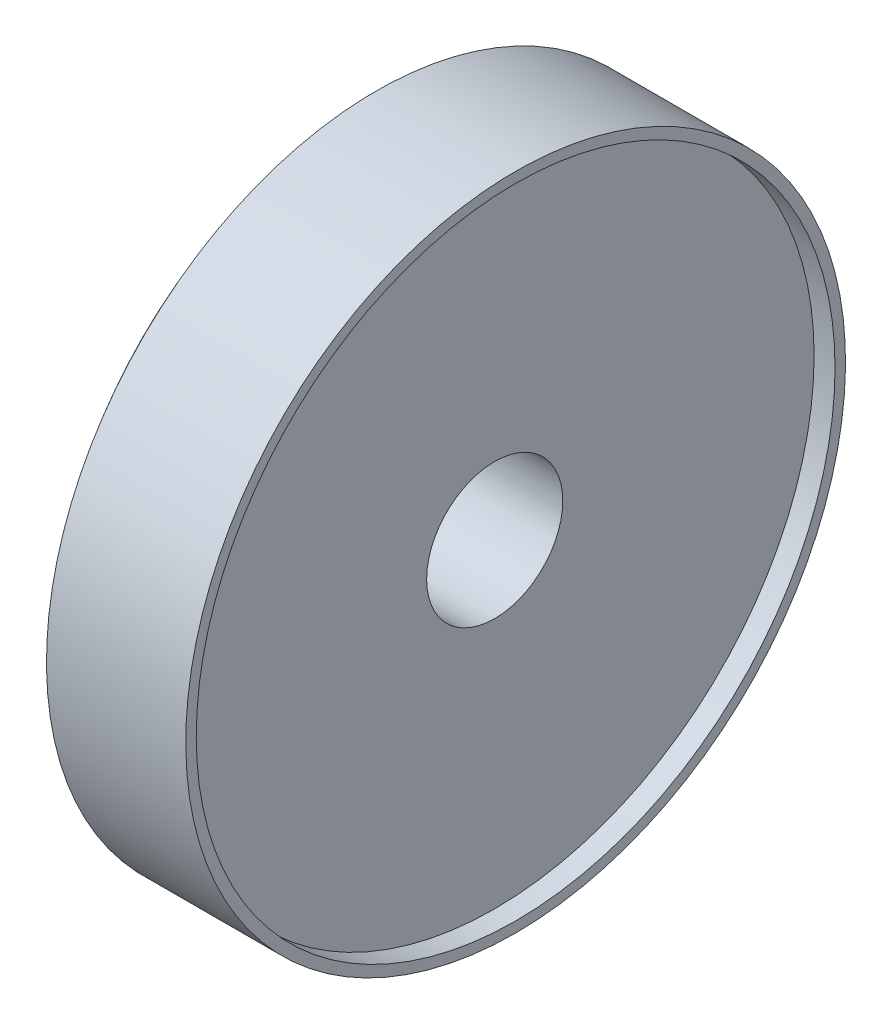
ISO-10303-21;
HEADER;
FILE_DESCRIPTION(('STEP AP214'),'2;1');
FILE_NAME('part.step','',(''),(''),'','','');
FILE_SCHEMA(('AUTOMOTIVE_DESIGN { 1 0 10303 214 1 1 1 1 }'));
ENDSEC;
DATA;
#1=APPLICATION_CONTEXT('core data for automotive mechanical design processes');
#2=APPLICATION_PROTOCOL_DEFINITION('international standard','automotive_design',2000,#1);
#3=PRODUCT_CONTEXT('',#1,'mechanical');
#4=PRODUCT('Part','Part','',(#3));
#5=PRODUCT_RELATED_PRODUCT_CATEGORY('part','',(#4));
#6=PRODUCT_DEFINITION_FORMATION('','',#4);
#7=PRODUCT_DEFINITION_CONTEXT('part definition',#1,'design');
#8=PRODUCT_DEFINITION('design','',#6,#7);
#9=PRODUCT_DEFINITION_SHAPE('','',#8);
#10=(LENGTH_UNIT() NAMED_UNIT(*) SI_UNIT(.MILLI.,.METRE.));
#11=(NAMED_UNIT(*) PLANE_ANGLE_UNIT() SI_UNIT($,.RADIAN.));
#12=(NAMED_UNIT(*) SI_UNIT($,.STERADIAN.) SOLID_ANGLE_UNIT());
#13=UNCERTAINTY_MEASURE_WITH_UNIT(LENGTH_MEASURE(1.E-05),#10,'distance_accuracy_value','');
#14=(GEOMETRIC_REPRESENTATION_CONTEXT(3) GLOBAL_UNCERTAINTY_ASSIGNED_CONTEXT((#13)) GLOBAL_UNIT_ASSIGNED_CONTEXT((#10,
#11,#12)) REPRESENTATION_CONTEXT('',''));
#15=CARTESIAN_POINT('',(0.,0.,0.));
#16=DIRECTION('',(0.,0.,1.));
#17=DIRECTION('',(1.,0.,0.));
#18=AXIS2_PLACEMENT_3D('',#15,#16,#17);
#19=CARTESIAN_POINT('',(-7.9,0.,0.));
#20=DIRECTION('',(-1.,0.,0.));
#21=DIRECTION('',(0.,-1.,0.));
#22=AXIS2_PLACEMENT_3D('',#19,#20,#21);
#23=CYLINDRICAL_SURFACE('',#22,31.5);
#24=CARTESIAN_POINT('',(-5.39999999999999,0.,0.));
#25=DIRECTION('',(-1.,0.,0.));
#26=DIRECTION('',(0.,-1.,0.));
#27=AXIS2_PLACEMENT_3D('',#24,#25,#26);
#28=CIRCLE('',#27,31.5);
#29=CARTESIAN_POINT('',(-5.39999999999998,-31.5,0.));
#30=VERTEX_POINT('',#29);
#31=EDGE_CURVE('E189',#30,#30,#28,.T.);
#32=ORIENTED_EDGE('',*,*,#31,.F.);
#33=EDGE_LOOP('',(#32));
#34=FACE_BOUND('',#33,.T.);
#35=CARTESIAN_POINT('',(7.9,0.,0.));
#36=DIRECTION('',(-1.,0.,0.));
#37=DIRECTION('',(0.,-1.,0.));
#38=AXIS2_PLACEMENT_3D('',#35,#36,#37);
#39=CIRCLE('',#38,31.5);
#40=CARTESIAN_POINT('',(7.90000000000001,-31.5,0.));
#41=VERTEX_POINT('',#40);
#42=EDGE_CURVE('E11',#41,#41,#39,.T.);
#43=ORIENTED_EDGE('',*,*,#42,.T.);
#44=EDGE_LOOP('',(#43));
#45=FACE_BOUND('',#44,.T.);
#46=ADVANCED_FACE('F37',(#34,#45),#23,.T.);
#47=CARTESIAN_POINT('',(7.9,0.,0.));
#48=DIRECTION('',(-1.,0.,0.));
#49=DIRECTION('',(0.,-1.,0.));
#50=AXIS2_PLACEMENT_3D('',#47,#48,#49);
#51=PLANE('',#50);
#52=CARTESIAN_POINT('',(7.9,0.,0.));
#53=DIRECTION('',(1.,0.,0.));
#54=DIRECTION('',(0.,1.,0.));
#55=AXIS2_PLACEMENT_3D('',#52,#53,#54);
#56=CIRCLE('',#55,30.5);
#57=CARTESIAN_POINT('',(7.9,30.5,0.));
#58=VERTEX_POINT('',#57);
#59=EDGE_CURVE('E185',#58,#58,#56,.T.);
#60=ORIENTED_EDGE('',*,*,#59,.F.);
#61=EDGE_LOOP('',(#60));
#62=FACE_BOUND('',#61,.T.);
#63=ORIENTED_EDGE('',*,*,#42,.F.);
#64=EDGE_LOOP('',(#63));
#65=FACE_BOUND('',#64,.T.);
#66=ADVANCED_FACE('F207',(#62,#65),#51,.F.);
#67=CARTESIAN_POINT('',(-7.9,0.,0.));
#68=DIRECTION('',(1.,0.,0.));
#69=DIRECTION('',(0.,1.,0.));
#70=AXIS2_PLACEMENT_3D('',#67,#68,#69);
#71=PLANE('',#70);
#72=CARTESIAN_POINT('',(-7.9,0.,0.));
#73=DIRECTION('',(-1.,0.,0.));
#74=DIRECTION('',(0.,-1.,0.));
#75=AXIS2_PLACEMENT_3D('',#72,#73,#74);
#76=CIRCLE('',#75,6.5);
#77=CARTESIAN_POINT('',(-7.89999999999999,-6.5,0.));
#78=VERTEX_POINT('',#77);
#79=EDGE_CURVE('E354',#78,#78,#76,.T.);
#80=ORIENTED_EDGE('',*,*,#79,.F.);
#81=EDGE_LOOP('',(#80));
#82=FACE_BOUND('',#81,.T.);
#83=CARTESIAN_POINT('',(-7.9,12.5,0.));
#84=DIRECTION('',(-1.,0.,0.));
#85=DIRECTION('',(0.,0.,1.));
#86=AXIS2_PLACEMENT_3D('',#83,#84,#85);
#87=CIRCLE('',#86,1.525);
#88=CARTESIAN_POINT('',(-7.9,12.5,1.525));
#89=VERTEX_POINT('',#88);
#90=EDGE_CURVE('E98',#89,#89,#87,.T.);
#91=ORIENTED_EDGE('',*,*,#90,.F.);
#92=EDGE_LOOP('',(#91));
#93=FACE_BOUND('',#92,.T.);
#94=CARTESIAN_POINT('',(-7.9,0.,-12.5));
#95=DIRECTION('',(-1.,0.,0.));
#96=DIRECTION('',(0.,0.,1.));
#97=AXIS2_PLACEMENT_3D('',#94,#95,#96);
#98=CIRCLE('',#97,1.525);
#99=CARTESIAN_POINT('',(-7.9,0.,-10.975));
#100=VERTEX_POINT('',#99);
#101=EDGE_CURVE('E91',#100,#100,#98,.T.);
#102=ORIENTED_EDGE('',*,*,#101,.F.);
#103=EDGE_LOOP('',(#102));
#104=FACE_BOUND('',#103,.T.);
#105=CARTESIAN_POINT('',(-7.9,-12.5,0.));
#106=DIRECTION('',(-1.,0.,0.));
#107=DIRECTION('',(0.,0.,1.));
#108=AXIS2_PLACEMENT_3D('',#105,#106,#107);
#109=CIRCLE('',#108,1.525);
#110=CARTESIAN_POINT('',(-7.9,-12.5,1.525));
#111=VERTEX_POINT('',#110);
#112=EDGE_CURVE('E107',#111,#111,#109,.T.);
#113=ORIENTED_EDGE('',*,*,#112,.F.);
#114=EDGE_LOOP('',(#113));
#115=FACE_BOUND('',#114,.T.);
#116=CARTESIAN_POINT('',(-7.9,0.,12.5));
#117=DIRECTION('',(-1.,0.,0.));
#118=DIRECTION('',(0.,0.,1.));
#119=AXIS2_PLACEMENT_3D('',#116,#117,#118);
#120=CIRCLE('',#119,1.525);
#121=CARTESIAN_POINT('',(-7.9,0.,14.025));
#122=VERTEX_POINT('',#121);
#123=EDGE_CURVE('E116',#122,#122,#120,.T.);
#124=ORIENTED_EDGE('',*,*,#123,.F.);
#125=EDGE_LOOP('',(#124));
#126=FACE_BOUND('',#125,.T.);
#127=CARTESIAN_POINT('',(-7.9,10.6066017177982,-10.6066017177982));
#128=DIRECTION('',(-1.,0.,0.));
#129=DIRECTION('',(0.,0.,1.));
#130=AXIS2_PLACEMENT_3D('',#127,#128,#129);
#131=CIRCLE('',#130,1.525);
#132=CARTESIAN_POINT('',(-7.9,10.6066017177982,-9.08160171779823));
#133=VERTEX_POINT('',#132);
#134=EDGE_CURVE('E125',#133,#133,#131,.T.);
#135=ORIENTED_EDGE('',*,*,#134,.F.);
#136=EDGE_LOOP('',(#135));
#137=FACE_BOUND('',#136,.T.);
#138=CARTESIAN_POINT('',(-7.9,-10.6066017177982,-10.6066017177982));
#139=DIRECTION('',(-1.,0.,0.));
#140=DIRECTION('',(0.,0.,1.));
#141=AXIS2_PLACEMENT_3D('',#138,#139,#140);
#142=CIRCLE('',#141,1.525);
#143=CARTESIAN_POINT('',(-7.9,-10.6066017177982,-9.08160171779823));
#144=VERTEX_POINT('',#143);
#145=EDGE_CURVE('E134',#144,#144,#142,.T.);
#146=ORIENTED_EDGE('',*,*,#145,.F.);
#147=EDGE_LOOP('',(#146));
#148=FACE_BOUND('',#147,.T.);
#149=CARTESIAN_POINT('',(-7.9,-10.6066017177982,10.6066017177982));
#150=DIRECTION('',(-1.,0.,0.));
#151=DIRECTION('',(0.,0.,1.));
#152=AXIS2_PLACEMENT_3D('',#149,#150,#151);
#153=CIRCLE('',#152,1.525);
#154=CARTESIAN_POINT('',(-7.9,-10.6066017177982,12.1316017177982));
#155=VERTEX_POINT('',#154);
#156=EDGE_CURVE('E143',#155,#155,#153,.T.);
#157=ORIENTED_EDGE('',*,*,#156,.F.);
#158=EDGE_LOOP('',(#157));
#159=FACE_BOUND('',#158,.T.);
#160=CARTESIAN_POINT('',(-7.9,10.6066017177982,10.6066017177982));
#161=DIRECTION('',(-1.,0.,0.));
#162=DIRECTION('',(0.,0.,1.));
#163=AXIS2_PLACEMENT_3D('',#160,#161,#162);
#164=CIRCLE('',#163,1.525);
#165=CARTESIAN_POINT('',(-7.9,10.6066017177982,12.1316017177982));
#166=VERTEX_POINT('',#165);
#167=EDGE_CURVE('E152',#166,#166,#164,.T.);
#168=ORIENTED_EDGE('',*,*,#167,.F.);
#169=EDGE_LOOP('',(#168));
#170=FACE_BOUND('',#169,.T.);
#171=CARTESIAN_POINT('',(-7.9,15.5563491861041,-15.556349186104));
#172=DIRECTION('',(-1.,0.,0.));
#173=DIRECTION('',(0.,0.,1.));
#174=AXIS2_PLACEMENT_3D('',#171,#172,#173);
#175=CIRCLE('',#174,1.24999999999999);
#176=CARTESIAN_POINT('',(-7.9,15.5563491861041,-14.306349186104));
#177=VERTEX_POINT('',#176);
#178=EDGE_CURVE('E161',#177,#177,#175,.T.);
#179=ORIENTED_EDGE('',*,*,#178,.F.);
#180=EDGE_LOOP('',(#179));
#181=FACE_BOUND('',#180,.T.);
#182=CARTESIAN_POINT('',(-7.9,15.5563491861041,15.556349186104));
#183=DIRECTION('',(-1.,0.,0.));
#184=DIRECTION('',(0.,0.,1.));
#185=AXIS2_PLACEMENT_3D('',#182,#183,#184);
#186=CIRCLE('',#185,1.24999999999999);
#187=CARTESIAN_POINT('',(-7.9,15.5563491861041,16.806349186104));
#188=VERTEX_POINT('',#187);
#189=EDGE_CURVE('E167',#188,#188,#186,.T.);
#190=ORIENTED_EDGE('',*,*,#189,.F.);
#191=EDGE_LOOP('',(#190));
#192=FACE_BOUND('',#191,.T.);
#193=CARTESIAN_POINT('',(-7.89999999999999,-15.5563491861041,15.556349186104));
#194=DIRECTION('',(-1.,0.,0.));
#195=DIRECTION('',(0.,0.,1.));
#196=AXIS2_PLACEMENT_3D('',#193,#194,#195);
#197=CIRCLE('',#196,1.24999999999999);
#198=CARTESIAN_POINT('',(-7.89999999999999,-15.5563491861041,16.806349186104));
#199=VERTEX_POINT('',#198);
#200=EDGE_CURVE('E173',#199,#199,#197,.T.);
#201=ORIENTED_EDGE('',*,*,#200,.F.);
#202=EDGE_LOOP('',(#201));
#203=FACE_BOUND('',#202,.T.);
#204=CARTESIAN_POINT('',(-7.89999999999999,-15.5563491861041,-15.556349186104));
#205=DIRECTION('',(-1.,0.,0.));
#206=DIRECTION('',(0.,0.,1.));
#207=AXIS2_PLACEMENT_3D('',#204,#205,#206);
#208=CIRCLE('',#207,1.24999999999999);
#209=CARTESIAN_POINT('',(-7.89999999999999,-15.5563491861041,-14.306349186104));
#210=VERTEX_POINT('',#209);
#211=EDGE_CURVE('E179',#210,#210,#208,.T.);
#212=ORIENTED_EDGE('',*,*,#211,.F.);
#213=EDGE_LOOP('',(#212));
#214=FACE_BOUND('',#213,.T.);
#215=CARTESIAN_POINT('',(-7.89999999999999,0.,0.));
#216=DIRECTION('',(-1.,0.,0.));
#217=DIRECTION('',(0.,-1.,0.));
#218=AXIS2_PLACEMENT_3D('',#215,#216,#217);
#219=CIRCLE('',#218,28.);
#220=CARTESIAN_POINT('',(-7.89999999999999,-28.,0.));
#221=VERTEX_POINT('',#220);
#222=EDGE_CURVE('E44',#221,#221,#219,.T.);
#223=ORIENTED_EDGE('',*,*,#222,.T.);
#224=EDGE_LOOP('',(#223));
#225=FACE_BOUND('',#224,.T.);
#226=ADVANCED_FACE('F196',(#82,#93,#104,#115,#126,#137,#148,#159,#170,#181,#192,#203,#214,#225),
#71,.F.);
#227=CARTESIAN_POINT('',(-5.39999999999999,0.,0.));
#228=DIRECTION('',(1.,0.,0.));
#229=DIRECTION('',(0.,1.,0.));
#230=AXIS2_PLACEMENT_3D('',#227,#228,#229);
#231=CONICAL_SURFACE('',#230,31.5,0.950546840812075);
#232=ORIENTED_EDGE('',*,*,#222,.F.);
#233=EDGE_LOOP('',(#232));
#234=FACE_BOUND('',#233,.T.);
#235=ORIENTED_EDGE('',*,*,#31,.T.);
#236=EDGE_LOOP('',(#235));
#237=FACE_BOUND('',#236,.T.);
#238=ADVANCED_FACE('F198',(#234,#237),#231,.T.);
#239=CARTESIAN_POINT('',(5.9,0.,0.));
#240=DIRECTION('',(1.,0.,0.));
#241=DIRECTION('',(0.,1.,0.));
#242=AXIS2_PLACEMENT_3D('',#239,#240,#241);
#243=CYLINDRICAL_SURFACE('',#242,30.5);
#244=CARTESIAN_POINT('',(5.9,0.,0.));
#245=DIRECTION('',(1.,0.,0.));
#246=DIRECTION('',(0.,1.,0.));
#247=AXIS2_PLACEMENT_3D('',#244,#245,#246);
#248=CIRCLE('',#247,30.5);
#249=CARTESIAN_POINT('',(5.9,30.5,0.));
#250=VERTEX_POINT('',#249);
#251=EDGE_CURVE('E186',#250,#250,#248,.T.);
#252=ORIENTED_EDGE('',*,*,#251,.F.);
#253=EDGE_LOOP('',(#252));
#254=FACE_BOUND('',#253,.T.);
#255=ORIENTED_EDGE('',*,*,#59,.T.);
#256=EDGE_LOOP('',(#255));
#257=FACE_BOUND('',#256,.T.);
#258=ADVANCED_FACE('F201',(#254,#257),#243,.F.);
#259=CARTESIAN_POINT('',(5.9,0.,0.));
#260=DIRECTION('',(1.,0.,0.));
#261=DIRECTION('',(0.,1.,0.));
#262=AXIS2_PLACEMENT_3D('',#259,#260,#261);
#263=PLANE('',#262);
#264=CARTESIAN_POINT('',(5.9,0.,0.));
#265=DIRECTION('',(1.,0.,0.));
#266=DIRECTION('',(0.,1.,0.));
#267=AXIS2_PLACEMENT_3D('',#264,#265,#266);
#268=CIRCLE('',#267,6.5);
#269=CARTESIAN_POINT('',(5.9,6.5,0.));
#270=VERTEX_POINT('',#269);
#271=EDGE_CURVE('E357',#270,#270,#268,.F.);
#272=ORIENTED_EDGE('',*,*,#271,.T.);
#273=EDGE_LOOP('',(#272));
#274=FACE_BOUND('',#273,.T.);
#275=ORIENTED_EDGE('',*,*,#251,.T.);
#276=EDGE_LOOP('',(#275));
#277=FACE_BOUND('',#276,.T.);
#278=ADVANCED_FACE('F222',(#274,#277),#263,.T.);
#279=CARTESIAN_POINT('',(-0.399999999999999,-15.5563491861041,-15.556349186104));
#280=DIRECTION('',(-1.,0.,0.));
#281=DIRECTION('',(0.,0.,1.));
#282=AXIS2_PLACEMENT_3D('',#279,#280,#281);
#283=CONICAL_SURFACE('',#282,1.24999999999999,1.02974425867664);
#284=CARTESIAN_POINT('',(0.351075773784459,-15.5563491861041,-15.556349186104));
#285=VERTEX_POINT('',#284);
#286=VERTEX_LOOP('',#285);
#287=FACE_BOUND('',#286,.T.);
#288=CARTESIAN_POINT('',(-0.399999999999999,-15.5563491861041,-15.556349186104));
#289=DIRECTION('',(-1.,0.,0.));
#290=DIRECTION('',(0.,0.,1.));
#291=AXIS2_PLACEMENT_3D('',#288,#289,#290);
#292=CIRCLE('',#291,1.24999999999999);
#293=CARTESIAN_POINT('',(-0.399999999999999,-15.5563491861041,-14.306349186104));
#294=VERTEX_POINT('',#293);
#295=EDGE_CURVE('E182',#294,#294,#292,.T.);
#296=ORIENTED_EDGE('',*,*,#295,.T.);
#297=EDGE_LOOP('',(#296));
#298=FACE_BOUND('',#297,.T.);
#299=ADVANCED_FACE('F226',(#287,#298),#283,.F.);
#300=CARTESIAN_POINT('',(-7.89999999999999,-15.5563491861041,-15.556349186104));
#301=DIRECTION('',(-1.,0.,0.));
#302=DIRECTION('',(0.,0.,1.));
#303=AXIS2_PLACEMENT_3D('',#300,#301,#302);
#304=CYLINDRICAL_SURFACE('',#303,1.24999999999999);
#305=ORIENTED_EDGE('',*,*,#295,.F.);
#306=EDGE_LOOP('',(#305));
#307=FACE_BOUND('',#306,.T.);
#308=ORIENTED_EDGE('',*,*,#211,.T.);
#309=EDGE_LOOP('',(#308));
#310=FACE_BOUND('',#309,.T.);
#311=ADVANCED_FACE('F230',(#307,#310),#304,.F.);
#312=CARTESIAN_POINT('',(-0.399999999999999,-15.5563491861041,15.556349186104));
#313=DIRECTION('',(-1.,0.,0.));
#314=DIRECTION('',(0.,0.,1.));
#315=AXIS2_PLACEMENT_3D('',#312,#313,#314);
#316=CONICAL_SURFACE('',#315,1.24999999999999,1.02974425867664);
#317=CARTESIAN_POINT('',(0.351075773784459,-15.5563491861041,15.556349186104));
#318=VERTEX_POINT('',#317);
#319=VERTEX_LOOP('',#318);
#320=FACE_BOUND('',#319,.T.);
#321=CARTESIAN_POINT('',(-0.399999999999999,-15.5563491861041,15.556349186104));
#322=DIRECTION('',(-1.,0.,0.));
#323=DIRECTION('',(0.,0.,1.));
#324=AXIS2_PLACEMENT_3D('',#321,#322,#323);
#325=CIRCLE('',#324,1.24999999999999);
#326=CARTESIAN_POINT('',(-0.399999999999999,-15.5563491861041,16.806349186104));
#327=VERTEX_POINT('',#326);
#328=EDGE_CURVE('E176',#327,#327,#325,.T.);
#329=ORIENTED_EDGE('',*,*,#328,.T.);
#330=EDGE_LOOP('',(#329));
#331=FACE_BOUND('',#330,.T.);
#332=ADVANCED_FACE('F233',(#320,#331),#316,.F.);
#333=CARTESIAN_POINT('',(-7.89999999999999,-15.5563491861041,15.556349186104));
#334=DIRECTION('',(-1.,0.,0.));
#335=DIRECTION('',(0.,0.,1.));
#336=AXIS2_PLACEMENT_3D('',#333,#334,#335);
#337=CYLINDRICAL_SURFACE('',#336,1.24999999999999);
#338=ORIENTED_EDGE('',*,*,#328,.F.);
#339=EDGE_LOOP('',(#338));
#340=FACE_BOUND('',#339,.T.);
#341=ORIENTED_EDGE('',*,*,#200,.T.);
#342=EDGE_LOOP('',(#341));
#343=FACE_BOUND('',#342,.T.);
#344=ADVANCED_FACE('F237',(#340,#343),#337,.F.);
#345=CARTESIAN_POINT('',(-0.400000000000006,15.5563491861041,15.556349186104));
#346=DIRECTION('',(-1.,0.,0.));
#347=DIRECTION('',(0.,0.,1.));
#348=AXIS2_PLACEMENT_3D('',#345,#346,#347);
#349=CONICAL_SURFACE('',#348,1.24999999999999,1.02974425867664);
#350=CARTESIAN_POINT('',(0.351075773784452,15.5563491861041,15.556349186104));
#351=VERTEX_POINT('',#350);
#352=VERTEX_LOOP('',#351);
#353=FACE_BOUND('',#352,.T.);
#354=CARTESIAN_POINT('',(-0.400000000000006,15.5563491861041,15.556349186104));
#355=DIRECTION('',(-1.,0.,0.));
#356=DIRECTION('',(0.,0.,1.));
#357=AXIS2_PLACEMENT_3D('',#354,#355,#356);
#358=CIRCLE('',#357,1.24999999999999);
#359=CARTESIAN_POINT('',(-0.400000000000006,15.5563491861041,16.806349186104));
#360=VERTEX_POINT('',#359);
#361=EDGE_CURVE('E170',#360,#360,#358,.T.);
#362=ORIENTED_EDGE('',*,*,#361,.T.);
#363=EDGE_LOOP('',(#362));
#364=FACE_BOUND('',#363,.T.);
#365=ADVANCED_FACE('F240',(#353,#364),#349,.F.);
#366=CARTESIAN_POINT('',(-7.9,15.5563491861041,15.556349186104));
#367=DIRECTION('',(-1.,0.,0.));
#368=DIRECTION('',(0.,0.,1.));
#369=AXIS2_PLACEMENT_3D('',#366,#367,#368);
#370=CYLINDRICAL_SURFACE('',#369,1.24999999999999);
#371=ORIENTED_EDGE('',*,*,#361,.F.);
#372=EDGE_LOOP('',(#371));
#373=FACE_BOUND('',#372,.T.);
#374=ORIENTED_EDGE('',*,*,#189,.T.);
#375=EDGE_LOOP('',(#374));
#376=FACE_BOUND('',#375,.T.);
#377=ADVANCED_FACE('F244',(#373,#376),#370,.F.);
#378=CARTESIAN_POINT('',(-0.400000000000006,15.5563491861041,-15.556349186104));
#379=DIRECTION('',(-1.,0.,0.));
#380=DIRECTION('',(0.,0.,1.));
#381=AXIS2_PLACEMENT_3D('',#378,#379,#380);
#382=CONICAL_SURFACE('',#381,1.24999999999999,1.02974425867664);
#383=CARTESIAN_POINT('',(0.351075773784452,15.5563491861041,-15.556349186104));
#384=VERTEX_POINT('',#383);
#385=VERTEX_LOOP('',#384);
#386=FACE_BOUND('',#385,.T.);
#387=CARTESIAN_POINT('',(-0.400000000000006,15.5563491861041,-15.556349186104));
#388=DIRECTION('',(-1.,0.,0.));
#389=DIRECTION('',(0.,0.,1.));
#390=AXIS2_PLACEMENT_3D('',#387,#388,#389);
#391=CIRCLE('',#390,1.24999999999999);
#392=CARTESIAN_POINT('',(-0.400000000000006,15.5563491861041,-14.306349186104));
#393=VERTEX_POINT('',#392);
#394=EDGE_CURVE('E164',#393,#393,#391,.T.);
#395=ORIENTED_EDGE('',*,*,#394,.T.);
#396=EDGE_LOOP('',(#395));
#397=FACE_BOUND('',#396,.T.);
#398=ADVANCED_FACE('F248',(#386,#397),#382,.F.);
#399=CARTESIAN_POINT('',(-7.9,15.5563491861041,-15.556349186104));
#400=DIRECTION('',(-1.,0.,0.));
#401=DIRECTION('',(0.,0.,1.));
#402=AXIS2_PLACEMENT_3D('',#399,#400,#401);
#403=CYLINDRICAL_SURFACE('',#402,1.24999999999999);
#404=ORIENTED_EDGE('',*,*,#394,.F.);
#405=EDGE_LOOP('',(#404));
#406=FACE_BOUND('',#405,.T.);
#407=ORIENTED_EDGE('',*,*,#178,.T.);
#408=EDGE_LOOP('',(#407));
#409=FACE_BOUND('',#408,.T.);
#410=ADVANCED_FACE('F252',(#406,#409),#403,.F.);
#411=CARTESIAN_POINT('',(-0.400000000000005,10.6066017177982,10.6066017177982));
#412=DIRECTION('',(-1.,0.,0.));
#413=DIRECTION('',(0.,0.,1.));
#414=AXIS2_PLACEMENT_3D('',#411,#412,#413);
#415=CONICAL_SURFACE('',#414,1.24999999999999,1.02974425867664);
#416=CARTESIAN_POINT('',(0.351075773784454,10.6066017177982,10.6066017177982));
#417=VERTEX_POINT('',#416);
#418=VERTEX_LOOP('',#417);
#419=FACE_BOUND('',#418,.T.);
#420=CARTESIAN_POINT('',(-0.400000000000005,10.6066017177982,10.6066017177982));
#421=DIRECTION('',(-1.,0.,0.));
#422=DIRECTION('',(0.,0.,1.));
#423=AXIS2_PLACEMENT_3D('',#420,#421,#422);
#424=CIRCLE('',#423,1.24999999999999);
#425=CARTESIAN_POINT('',(-0.400000000000005,10.6066017177982,11.8566017177982));
#426=VERTEX_POINT('',#425);
#427=EDGE_CURVE('E158',#426,#426,#424,.T.);
#428=ORIENTED_EDGE('',*,*,#427,.T.);
#429=EDGE_LOOP('',(#428));
#430=FACE_BOUND('',#429,.T.);
#431=ADVANCED_FACE('F256',(#419,#430),#415,.F.);
#432=CARTESIAN_POINT('',(-7.9,10.6066017177982,10.6066017177982));
#433=DIRECTION('',(-1.,0.,0.));
#434=DIRECTION('',(0.,0.,1.));
#435=AXIS2_PLACEMENT_3D('',#432,#433,#434);
#436=CYLINDRICAL_SURFACE('',#435,1.24999999999999);
#437=ORIENTED_EDGE('',*,*,#427,.F.);
#438=EDGE_LOOP('',(#437));
#439=FACE_BOUND('',#438,.T.);
#440=CARTESIAN_POINT('',(-7.625,10.6066017177982,10.6066017177982));
#441=DIRECTION('',(-1.,0.,0.));
#442=DIRECTION('',(0.,0.,1.));
#443=AXIS2_PLACEMENT_3D('',#440,#441,#442);
#444=CIRCLE('',#443,1.24999999999999);
#445=CARTESIAN_POINT('',(-7.625,10.6066017177982,11.8566017177982));
#446=VERTEX_POINT('',#445);
#447=EDGE_CURVE('E155',#446,#446,#444,.T.);
#448=ORIENTED_EDGE('',*,*,#447,.T.);
#449=EDGE_LOOP('',(#448));
#450=FACE_BOUND('',#449,.T.);
#451=ADVANCED_FACE('F260',(#439,#450),#436,.F.);
#452=CARTESIAN_POINT('',(-7.9,10.6066017177982,10.6066017177982));
#453=DIRECTION('',(-1.,0.,0.));
#454=DIRECTION('',(0.,0.,1.));
#455=AXIS2_PLACEMENT_3D('',#452,#453,#454);
#456=CONICAL_SURFACE('',#455,1.525,0.78539816339747);
#457=ORIENTED_EDGE('',*,*,#447,.F.);
#458=EDGE_LOOP('',(#457));
#459=FACE_BOUND('',#458,.T.);
#460=ORIENTED_EDGE('',*,*,#167,.T.);
#461=EDGE_LOOP('',(#460));
#462=FACE_BOUND('',#461,.T.);
#463=ADVANCED_FACE('F264',(#459,#462),#456,.F.);
#464=CARTESIAN_POINT('',(-0.400000000000001,-10.6066017177982,10.6066017177982));
#465=DIRECTION('',(-1.,0.,0.));
#466=DIRECTION('',(0.,0.,1.));
#467=AXIS2_PLACEMENT_3D('',#464,#465,#466);
#468=CONICAL_SURFACE('',#467,1.24999999999999,1.02974425867664);
#469=CARTESIAN_POINT('',(0.351075773784458,-10.6066017177982,10.6066017177982));
#470=VERTEX_POINT('',#469);
#471=VERTEX_LOOP('',#470);
#472=FACE_BOUND('',#471,.T.);
#473=CARTESIAN_POINT('',(-0.400000000000001,-10.6066017177982,10.6066017177982));
#474=DIRECTION('',(-1.,0.,0.));
#475=DIRECTION('',(0.,0.,1.));
#476=AXIS2_PLACEMENT_3D('',#473,#474,#475);
#477=CIRCLE('',#476,1.24999999999999);
#478=CARTESIAN_POINT('',(-0.400000000000001,-10.6066017177982,11.8566017177982));
#479=VERTEX_POINT('',#478);
#480=EDGE_CURVE('E149',#479,#479,#477,.T.);
#481=ORIENTED_EDGE('',*,*,#480,.T.);
#482=EDGE_LOOP('',(#481));
#483=FACE_BOUND('',#482,.T.);
#484=ADVANCED_FACE('F268',(#472,#483),#468,.F.);
#485=CARTESIAN_POINT('',(-7.89999999999999,-10.6066017177982,10.6066017177982));
#486=DIRECTION('',(-1.,0.,0.));
#487=DIRECTION('',(0.,0.,1.));
#488=AXIS2_PLACEMENT_3D('',#485,#486,#487);
#489=CYLINDRICAL_SURFACE('',#488,1.24999999999999);
#490=ORIENTED_EDGE('',*,*,#480,.F.);
#491=EDGE_LOOP('',(#490));
#492=FACE_BOUND('',#491,.T.);
#493=CARTESIAN_POINT('',(-7.625,-10.6066017177982,10.6066017177982));
#494=DIRECTION('',(-1.,0.,0.));
#495=DIRECTION('',(0.,0.,1.));
#496=AXIS2_PLACEMENT_3D('',#493,#494,#495);
#497=CIRCLE('',#496,1.24999999999999);
#498=CARTESIAN_POINT('',(-7.625,-10.6066017177982,11.8566017177982));
#499=VERTEX_POINT('',#498);
#500=EDGE_CURVE('E146',#499,#499,#497,.T.);
#501=ORIENTED_EDGE('',*,*,#500,.T.);
#502=EDGE_LOOP('',(#501));
#503=FACE_BOUND('',#502,.T.);
#504=ADVANCED_FACE('F272',(#492,#503),#489,.F.);
#505=CARTESIAN_POINT('',(-7.9,-10.6066017177982,10.6066017177982));
#506=DIRECTION('',(-1.,0.,0.));
#507=DIRECTION('',(0.,0.,1.));
#508=AXIS2_PLACEMENT_3D('',#505,#506,#507);
#509=CONICAL_SURFACE('',#508,1.525,0.78539816339747);
#510=ORIENTED_EDGE('',*,*,#500,.F.);
#511=EDGE_LOOP('',(#510));
#512=FACE_BOUND('',#511,.T.);
#513=ORIENTED_EDGE('',*,*,#156,.T.);
#514=EDGE_LOOP('',(#513));
#515=FACE_BOUND('',#514,.T.);
#516=ADVANCED_FACE('F276',(#512,#515),#509,.F.);
#517=CARTESIAN_POINT('',(-0.400000000000001,-10.6066017177982,-10.6066017177982));
#518=DIRECTION('',(-1.,0.,0.));
#519=DIRECTION('',(0.,0.,1.));
#520=AXIS2_PLACEMENT_3D('',#517,#518,#519);
#521=CONICAL_SURFACE('',#520,1.24999999999999,1.02974425867664);
#522=CARTESIAN_POINT('',(0.351075773784458,-10.6066017177982,-10.6066017177982));
#523=VERTEX_POINT('',#522);
#524=VERTEX_LOOP('',#523);
#525=FACE_BOUND('',#524,.T.);
#526=CARTESIAN_POINT('',(-0.400000000000001,-10.6066017177982,-10.6066017177982));
#527=DIRECTION('',(-1.,0.,0.));
#528=DIRECTION('',(0.,0.,1.));
#529=AXIS2_PLACEMENT_3D('',#526,#527,#528);
#530=CIRCLE('',#529,1.24999999999999);
#531=CARTESIAN_POINT('',(-0.400000000000001,-10.6066017177982,-9.35660171779824));
#532=VERTEX_POINT('',#531);
#533=EDGE_CURVE('E140',#532,#532,#530,.T.);
#534=ORIENTED_EDGE('',*,*,#533,.T.);
#535=EDGE_LOOP('',(#534));
#536=FACE_BOUND('',#535,.T.);
#537=ADVANCED_FACE('F280',(#525,#536),#521,.F.);
#538=CARTESIAN_POINT('',(-7.89999999999999,-10.6066017177982,-10.6066017177982));
#539=DIRECTION('',(-1.,0.,0.));
#540=DIRECTION('',(0.,0.,1.));
#541=AXIS2_PLACEMENT_3D('',#538,#539,#540);
#542=CYLINDRICAL_SURFACE('',#541,1.24999999999999);
#543=ORIENTED_EDGE('',*,*,#533,.F.);
#544=EDGE_LOOP('',(#543));
#545=FACE_BOUND('',#544,.T.);
#546=CARTESIAN_POINT('',(-7.625,-10.6066017177982,-10.6066017177982));
#547=DIRECTION('',(-1.,0.,0.));
#548=DIRECTION('',(0.,0.,1.));
#549=AXIS2_PLACEMENT_3D('',#546,#547,#548);
#550=CIRCLE('',#549,1.24999999999999);
#551=CARTESIAN_POINT('',(-7.625,-10.6066017177982,-9.35660171779824));
#552=VERTEX_POINT('',#551);
#553=EDGE_CURVE('E137',#552,#552,#550,.T.);
#554=ORIENTED_EDGE('',*,*,#553,.T.);
#555=EDGE_LOOP('',(#554));
#556=FACE_BOUND('',#555,.T.);
#557=ADVANCED_FACE('F284',(#545,#556),#542,.F.);
#558=CARTESIAN_POINT('',(-7.9,-10.6066017177982,-10.6066017177982));
#559=DIRECTION('',(-1.,0.,0.));
#560=DIRECTION('',(0.,0.,1.));
#561=AXIS2_PLACEMENT_3D('',#558,#559,#560);
#562=CONICAL_SURFACE('',#561,1.525,0.78539816339747);
#563=ORIENTED_EDGE('',*,*,#553,.F.);
#564=EDGE_LOOP('',(#563));
#565=FACE_BOUND('',#564,.T.);
#566=ORIENTED_EDGE('',*,*,#145,.T.);
#567=EDGE_LOOP('',(#566));
#568=FACE_BOUND('',#567,.T.);
#569=ADVANCED_FACE('F288',(#565,#568),#562,.F.);
#570=CARTESIAN_POINT('',(-0.400000000000005,10.6066017177982,-10.6066017177982));
#571=DIRECTION('',(-1.,0.,0.));
#572=DIRECTION('',(0.,0.,1.));
#573=AXIS2_PLACEMENT_3D('',#570,#571,#572);
#574=CONICAL_SURFACE('',#573,1.24999999999999,1.02974425867664);
#575=CARTESIAN_POINT('',(0.351075773784454,10.6066017177982,-10.6066017177982));
#576=VERTEX_POINT('',#575);
#577=VERTEX_LOOP('',#576);
#578=FACE_BOUND('',#577,.T.);
#579=CARTESIAN_POINT('',(-0.400000000000005,10.6066017177982,-10.6066017177982));
#580=DIRECTION('',(-1.,0.,0.));
#581=DIRECTION('',(0.,0.,1.));
#582=AXIS2_PLACEMENT_3D('',#579,#580,#581);
#583=CIRCLE('',#582,1.24999999999999);
#584=CARTESIAN_POINT('',(-0.400000000000005,10.6066017177982,-9.35660171779825));
#585=VERTEX_POINT('',#584);
#586=EDGE_CURVE('E131',#585,#585,#583,.T.);
#587=ORIENTED_EDGE('',*,*,#586,.T.);
#588=EDGE_LOOP('',(#587));
#589=FACE_BOUND('',#588,.T.);
#590=ADVANCED_FACE('F292',(#578,#589),#574,.F.);
#591=CARTESIAN_POINT('',(-7.9,10.6066017177982,-10.6066017177982));
#592=DIRECTION('',(-1.,0.,0.));
#593=DIRECTION('',(0.,0.,1.));
#594=AXIS2_PLACEMENT_3D('',#591,#592,#593);
#595=CYLINDRICAL_SURFACE('',#594,1.24999999999999);
#596=ORIENTED_EDGE('',*,*,#586,.F.);
#597=EDGE_LOOP('',(#596));
#598=FACE_BOUND('',#597,.T.);
#599=CARTESIAN_POINT('',(-7.625,10.6066017177982,-10.6066017177982));
#600=DIRECTION('',(-1.,0.,0.));
#601=DIRECTION('',(0.,0.,1.));
#602=AXIS2_PLACEMENT_3D('',#599,#600,#601);
#603=CIRCLE('',#602,1.24999999999999);
#604=CARTESIAN_POINT('',(-7.625,10.6066017177982,-9.35660171779825));
#605=VERTEX_POINT('',#604);
#606=EDGE_CURVE('E128',#605,#605,#603,.T.);
#607=ORIENTED_EDGE('',*,*,#606,.T.);
#608=EDGE_LOOP('',(#607));
#609=FACE_BOUND('',#608,.T.);
#610=ADVANCED_FACE('F296',(#598,#609),#595,.F.);
#611=CARTESIAN_POINT('',(-7.9,10.6066017177982,-10.6066017177982));
#612=DIRECTION('',(-1.,0.,0.));
#613=DIRECTION('',(0.,0.,1.));
#614=AXIS2_PLACEMENT_3D('',#611,#612,#613);
#615=CONICAL_SURFACE('',#614,1.525,0.78539816339747);
#616=ORIENTED_EDGE('',*,*,#606,.F.);
#617=EDGE_LOOP('',(#616));
#618=FACE_BOUND('',#617,.T.);
#619=ORIENTED_EDGE('',*,*,#134,.T.);
#620=EDGE_LOOP('',(#619));
#621=FACE_BOUND('',#620,.T.);
#622=ADVANCED_FACE('F300',(#618,#621),#615,.F.);
#623=CARTESIAN_POINT('',(-0.400000000000003,0.,12.5));
#624=DIRECTION('',(-1.,0.,0.));
#625=DIRECTION('',(0.,0.,1.));
#626=AXIS2_PLACEMENT_3D('',#623,#624,#625);
#627=CONICAL_SURFACE('',#626,1.24999999999999,1.02974425867664);
#628=CARTESIAN_POINT('',(0.351075773784456,0.,12.5));
#629=VERTEX_POINT('',#628);
#630=VERTEX_LOOP('',#629);
#631=FACE_BOUND('',#630,.T.);
#632=CARTESIAN_POINT('',(-0.400000000000003,0.,12.5));
#633=DIRECTION('',(-1.,0.,0.));
#634=DIRECTION('',(0.,0.,1.));
#635=AXIS2_PLACEMENT_3D('',#632,#633,#634);
#636=CIRCLE('',#635,1.24999999999999);
#637=CARTESIAN_POINT('',(-0.400000000000003,0.,13.75));
#638=VERTEX_POINT('',#637);
#639=EDGE_CURVE('E122',#638,#638,#636,.T.);
#640=ORIENTED_EDGE('',*,*,#639,.T.);
#641=EDGE_LOOP('',(#640));
#642=FACE_BOUND('',#641,.T.);
#643=ADVANCED_FACE('F304',(#631,#642),#627,.F.);
#644=CARTESIAN_POINT('',(-7.9,0.,12.5));
#645=DIRECTION('',(-1.,0.,0.));
#646=DIRECTION('',(0.,0.,1.));
#647=AXIS2_PLACEMENT_3D('',#644,#645,#646);
#648=CYLINDRICAL_SURFACE('',#647,1.24999999999999);
#649=ORIENTED_EDGE('',*,*,#639,.F.);
#650=EDGE_LOOP('',(#649));
#651=FACE_BOUND('',#650,.T.);
#652=CARTESIAN_POINT('',(-7.625,0.,12.5));
#653=DIRECTION('',(-1.,0.,0.));
#654=DIRECTION('',(0.,0.,1.));
#655=AXIS2_PLACEMENT_3D('',#652,#653,#654);
#656=CIRCLE('',#655,1.24999999999999);
#657=CARTESIAN_POINT('',(-7.625,0.,13.75));
#658=VERTEX_POINT('',#657);
#659=EDGE_CURVE('E119',#658,#658,#656,.T.);
#660=ORIENTED_EDGE('',*,*,#659,.T.);
#661=EDGE_LOOP('',(#660));
#662=FACE_BOUND('',#661,.T.);
#663=ADVANCED_FACE('F308',(#651,#662),#648,.F.);
#664=CARTESIAN_POINT('',(-7.9,0.,12.5));
#665=DIRECTION('',(-1.,0.,0.));
#666=DIRECTION('',(0.,0.,1.));
#667=AXIS2_PLACEMENT_3D('',#664,#665,#666);
#668=CONICAL_SURFACE('',#667,1.525,0.78539816339747);
#669=ORIENTED_EDGE('',*,*,#659,.F.);
#670=EDGE_LOOP('',(#669));
#671=FACE_BOUND('',#670,.T.);
#672=ORIENTED_EDGE('',*,*,#123,.T.);
#673=EDGE_LOOP('',(#672));
#674=FACE_BOUND('',#673,.T.);
#675=ADVANCED_FACE('F312',(#671,#674),#668,.F.);
#676=CARTESIAN_POINT('',(-0.400000000000001,-12.5,0.));
#677=DIRECTION('',(-1.,0.,0.));
#678=DIRECTION('',(0.,0.,1.));
#679=AXIS2_PLACEMENT_3D('',#676,#677,#678);
#680=CONICAL_SURFACE('',#679,1.24999999999999,1.02974425867664);
#681=CARTESIAN_POINT('',(0.351075773784458,-12.5,0.));
#682=VERTEX_POINT('',#681);
#683=VERTEX_LOOP('',#682);
#684=FACE_BOUND('',#683,.T.);
#685=CARTESIAN_POINT('',(-0.400000000000001,-12.5,0.));
#686=DIRECTION('',(-1.,0.,0.));
#687=DIRECTION('',(0.,0.,1.));
#688=AXIS2_PLACEMENT_3D('',#685,#686,#687);
#689=CIRCLE('',#688,1.24999999999999);
#690=CARTESIAN_POINT('',(-0.400000000000001,-12.5,1.24999999999999));
#691=VERTEX_POINT('',#690);
#692=EDGE_CURVE('E113',#691,#691,#689,.T.);
#693=ORIENTED_EDGE('',*,*,#692,.T.);
#694=EDGE_LOOP('',(#693));
#695=FACE_BOUND('',#694,.T.);
#696=ADVANCED_FACE('F316',(#684,#695),#680,.F.);
#697=CARTESIAN_POINT('',(-7.89999999999999,-12.5,0.));
#698=DIRECTION('',(-1.,0.,0.));
#699=DIRECTION('',(0.,0.,1.));
#700=AXIS2_PLACEMENT_3D('',#697,#698,#699);
#701=CYLINDRICAL_SURFACE('',#700,1.24999999999999);
#702=ORIENTED_EDGE('',*,*,#692,.F.);
#703=EDGE_LOOP('',(#702));
#704=FACE_BOUND('',#703,.T.);
#705=CARTESIAN_POINT('',(-7.625,-12.5,0.));
#706=DIRECTION('',(-1.,0.,0.));
#707=DIRECTION('',(0.,0.,1.));
#708=AXIS2_PLACEMENT_3D('',#705,#706,#707);
#709=CIRCLE('',#708,1.24999999999999);
#710=CARTESIAN_POINT('',(-7.625,-12.5,1.24999999999999));
#711=VERTEX_POINT('',#710);
#712=EDGE_CURVE('E110',#711,#711,#709,.T.);
#713=ORIENTED_EDGE('',*,*,#712,.T.);
#714=EDGE_LOOP('',(#713));
#715=FACE_BOUND('',#714,.T.);
#716=ADVANCED_FACE('F320',(#704,#715),#701,.F.);
#717=CARTESIAN_POINT('',(-7.9,-12.5,0.));
#718=DIRECTION('',(-1.,0.,0.));
#719=DIRECTION('',(0.,0.,1.));
#720=AXIS2_PLACEMENT_3D('',#717,#718,#719);
#721=CONICAL_SURFACE('',#720,1.525,0.78539816339747);
#722=ORIENTED_EDGE('',*,*,#712,.F.);
#723=EDGE_LOOP('',(#722));
#724=FACE_BOUND('',#723,.T.);
#725=ORIENTED_EDGE('',*,*,#112,.T.);
#726=EDGE_LOOP('',(#725));
#727=FACE_BOUND('',#726,.T.);
#728=ADVANCED_FACE('F324',(#724,#727),#721,.F.);
#729=CARTESIAN_POINT('',(-0.400000000000003,0.,-12.5));
#730=DIRECTION('',(-1.,0.,0.));
#731=DIRECTION('',(0.,0.,1.));
#732=AXIS2_PLACEMENT_3D('',#729,#730,#731);
#733=CONICAL_SURFACE('',#732,1.24999999999999,1.02974425867664);
#734=CARTESIAN_POINT('',(0.351075773784456,0.,-12.5));
#735=VERTEX_POINT('',#734);
#736=VERTEX_LOOP('',#735);
#737=FACE_BOUND('',#736,.T.);
#738=CARTESIAN_POINT('',(-0.400000000000003,0.,-12.5));
#739=DIRECTION('',(-1.,0.,0.));
#740=DIRECTION('',(0.,0.,1.));
#741=AXIS2_PLACEMENT_3D('',#738,#739,#740);
#742=CIRCLE('',#741,1.24999999999999);
#743=CARTESIAN_POINT('',(-0.400000000000003,0.,-11.25));
#744=VERTEX_POINT('',#743);
#745=EDGE_CURVE('E104',#744,#744,#742,.T.);
#746=ORIENTED_EDGE('',*,*,#745,.T.);
#747=EDGE_LOOP('',(#746));
#748=FACE_BOUND('',#747,.T.);
#749=ADVANCED_FACE('F328',(#737,#748),#733,.F.);
#750=CARTESIAN_POINT('',(-7.9,0.,-12.5));
#751=DIRECTION('',(-1.,0.,0.));
#752=DIRECTION('',(0.,0.,1.));
#753=AXIS2_PLACEMENT_3D('',#750,#751,#752);
#754=CYLINDRICAL_SURFACE('',#753,1.24999999999999);
#755=ORIENTED_EDGE('',*,*,#745,.F.);
#756=EDGE_LOOP('',(#755));
#757=FACE_BOUND('',#756,.T.);
#758=CARTESIAN_POINT('',(-7.625,0.,-12.5));
#759=DIRECTION('',(-1.,0.,0.));
#760=DIRECTION('',(0.,0.,1.));
#761=AXIS2_PLACEMENT_3D('',#758,#759,#760);
#762=CIRCLE('',#761,1.24999999999999);
#763=CARTESIAN_POINT('',(-7.625,0.,-11.25));
#764=VERTEX_POINT('',#763);
#765=EDGE_CURVE('E95',#764,#764,#762,.T.);
#766=ORIENTED_EDGE('',*,*,#765,.T.);
#767=EDGE_LOOP('',(#766));
#768=FACE_BOUND('',#767,.T.);
#769=ADVANCED_FACE('F332',(#757,#768),#754,.F.);
#770=CARTESIAN_POINT('',(-7.9,0.,-12.5));
#771=DIRECTION('',(-1.,0.,0.));
#772=DIRECTION('',(0.,0.,1.));
#773=AXIS2_PLACEMENT_3D('',#770,#771,#772);
#774=CONICAL_SURFACE('',#773,1.525,0.78539816339747);
#775=ORIENTED_EDGE('',*,*,#765,.F.);
#776=EDGE_LOOP('',(#775));
#777=FACE_BOUND('',#776,.T.);
#778=ORIENTED_EDGE('',*,*,#101,.T.);
#779=EDGE_LOOP('',(#778));
#780=FACE_BOUND('',#779,.T.);
#781=ADVANCED_FACE('F85',(#777,#780),#774,.F.);
#782=CARTESIAN_POINT('',(-0.400000000000005,12.5,0.));
#783=DIRECTION('',(-1.,0.,0.));
#784=DIRECTION('',(0.,0.,1.));
#785=AXIS2_PLACEMENT_3D('',#782,#783,#784);
#786=CONICAL_SURFACE('',#785,1.24999999999999,1.02974425867664);
#787=CARTESIAN_POINT('',(0.351075773784454,12.5,0.));
#788=VERTEX_POINT('',#787);
#789=VERTEX_LOOP('',#788);
#790=FACE_BOUND('',#789,.T.);
#791=CARTESIAN_POINT('',(-0.400000000000005,12.5,0.));
#792=DIRECTION('',(-1.,0.,0.));
#793=DIRECTION('',(0.,0.,1.));
#794=AXIS2_PLACEMENT_3D('',#791,#792,#793);
#795=CIRCLE('',#794,1.24999999999999);
#796=CARTESIAN_POINT('',(-0.400000000000005,12.5,1.24999999999999));
#797=VERTEX_POINT('',#796);
#798=EDGE_CURVE('E89',#797,#797,#795,.T.);
#799=ORIENTED_EDGE('',*,*,#798,.T.);
#800=EDGE_LOOP('',(#799));
#801=FACE_BOUND('',#800,.T.);
#802=ADVANCED_FACE('F81',(#790,#801),#786,.F.);
#803=CARTESIAN_POINT('',(-7.9,12.5,0.));
#804=DIRECTION('',(-1.,0.,0.));
#805=DIRECTION('',(0.,0.,1.));
#806=AXIS2_PLACEMENT_3D('',#803,#804,#805);
#807=CYLINDRICAL_SURFACE('',#806,1.24999999999999);
#808=ORIENTED_EDGE('',*,*,#798,.F.);
#809=EDGE_LOOP('',(#808));
#810=FACE_BOUND('',#809,.T.);
#811=CARTESIAN_POINT('',(-7.625,12.5,0.));
#812=DIRECTION('',(-1.,0.,0.));
#813=DIRECTION('',(0.,0.,1.));
#814=AXIS2_PLACEMENT_3D('',#811,#812,#813);
#815=CIRCLE('',#814,1.24999999999999);
#816=CARTESIAN_POINT('',(-7.625,12.5,1.24999999999999));
#817=VERTEX_POINT('',#816);
#818=EDGE_CURVE('E92',#817,#817,#815,.T.);
#819=ORIENTED_EDGE('',*,*,#818,.T.);
#820=EDGE_LOOP('',(#819));
#821=FACE_BOUND('',#820,.T.);
#822=ADVANCED_FACE('F84',(#810,#821),#807,.F.);
#823=CARTESIAN_POINT('',(-7.9,12.5,0.));
#824=DIRECTION('',(-1.,0.,0.));
#825=DIRECTION('',(0.,0.,1.));
#826=AXIS2_PLACEMENT_3D('',#823,#824,#825);
#827=CONICAL_SURFACE('',#826,1.525,0.78539816339747);
#828=ORIENTED_EDGE('',*,*,#818,.F.);
#829=EDGE_LOOP('',(#828));
#830=FACE_BOUND('',#829,.T.);
#831=ORIENTED_EDGE('',*,*,#90,.T.);
#832=EDGE_LOOP('',(#831));
#833=FACE_BOUND('',#832,.T.);
#834=ADVANCED_FACE('F342',(#830,#833),#827,.F.);
#835=CARTESIAN_POINT('',(24.2847763108502,0.,0.));
#836=DIRECTION('',(-1.,0.,0.));
#837=DIRECTION('',(0.,-1.,0.));
#838=AXIS2_PLACEMENT_3D('',#835,#836,#837);
#839=CYLINDRICAL_SURFACE('',#838,6.5);
#840=ORIENTED_EDGE('',*,*,#79,.T.);
#841=EDGE_LOOP('',(#840));
#842=FACE_BOUND('',#841,.T.);
#843=ORIENTED_EDGE('',*,*,#271,.F.);
#844=EDGE_LOOP('',(#843));
#845=FACE_BOUND('',#844,.T.);
#846=ADVANCED_FACE('F345',(#842,#845),#839,.F.);
#847=CLOSED_SHELL('',(#46,#66,#226,#238,#258,#278,#299,#311,#332,#344,#365,#377,#398,#410,#431,
#451,#463,#484,#504,#516,#537,#557,#569,#590,#610,#622,#643,#663,#675,#696,#716,#728,#749,#769,
#781,#802,#822,#834,#846));
#848=MANIFOLD_SOLID_BREP('B2',#847);
#849=ADVANCED_BREP_SHAPE_REPRESENTATION('',(#18,#848),#14);
#850=SHAPE_DEFINITION_REPRESENTATION(#9,#849);
ENDSEC;
END-ISO-10303-21;
